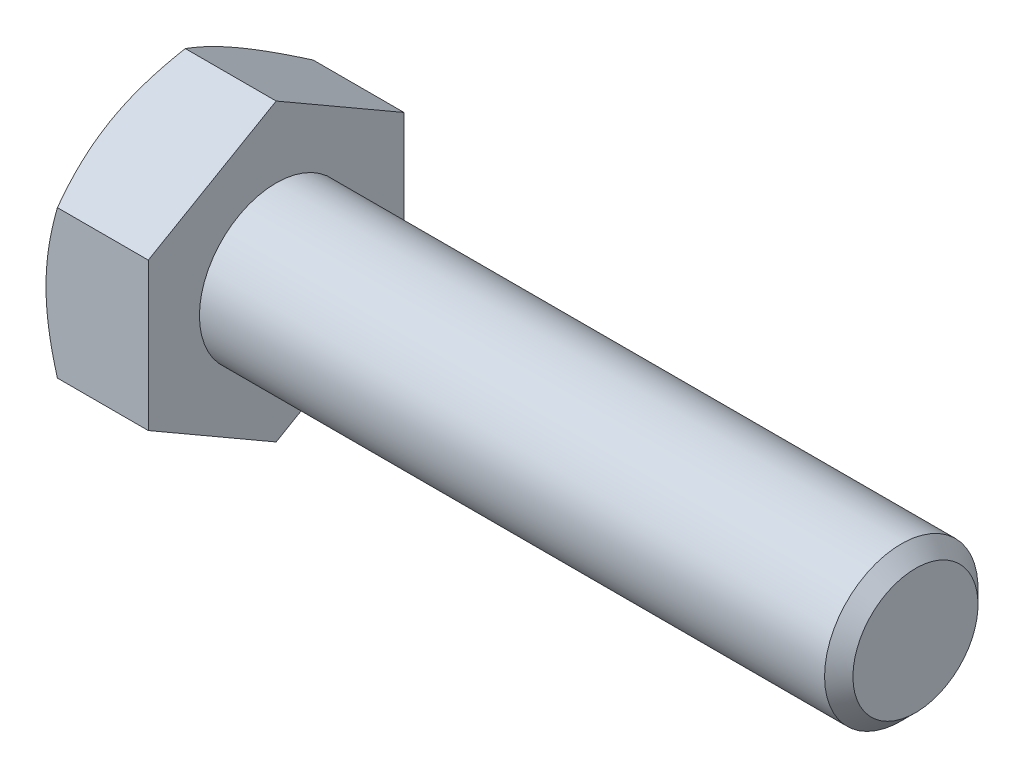
ISO-10303-21;
HEADER;
FILE_DESCRIPTION(('STEP AP214'),'2;1');
FILE_NAME('part.step','',(''),(''),'','','');
FILE_SCHEMA(('AUTOMOTIVE_DESIGN { 1 0 10303 214 1 1 1 1 }'));
ENDSEC;
DATA;
#1=APPLICATION_CONTEXT('core data for automotive mechanical design processes');
#2=APPLICATION_PROTOCOL_DEFINITION('international standard','automotive_design',2000,#1);
#3=PRODUCT_CONTEXT('',#1,'mechanical');
#4=PRODUCT('Part','Part','',(#3));
#5=PRODUCT_RELATED_PRODUCT_CATEGORY('part','',(#4));
#6=PRODUCT_DEFINITION_FORMATION('','',#4);
#7=PRODUCT_DEFINITION_CONTEXT('part definition',#1,'design');
#8=PRODUCT_DEFINITION('design','',#6,#7);
#9=PRODUCT_DEFINITION_SHAPE('','',#8);
#10=(LENGTH_UNIT() NAMED_UNIT(*) SI_UNIT(.MILLI.,.METRE.));
#11=(NAMED_UNIT(*) PLANE_ANGLE_UNIT() SI_UNIT($,.RADIAN.));
#12=(NAMED_UNIT(*) SI_UNIT($,.STERADIAN.) SOLID_ANGLE_UNIT());
#13=UNCERTAINTY_MEASURE_WITH_UNIT(LENGTH_MEASURE(1.E-05),#10,'distance_accuracy_value','');
#14=(GEOMETRIC_REPRESENTATION_CONTEXT(3) GLOBAL_UNCERTAINTY_ASSIGNED_CONTEXT((#13)) GLOBAL_UNIT_ASSIGNED_CONTEXT((#10,
#11,#12)) REPRESENTATION_CONTEXT('',''));
#15=CARTESIAN_POINT('',(0.,0.,0.));
#16=DIRECTION('',(0.,0.,1.));
#17=DIRECTION('',(1.,0.,0.));
#18=AXIS2_PLACEMENT_3D('',#15,#16,#17);
#19=CARTESIAN_POINT('',(4.,2.88675134594813,-5.));
#20=DIRECTION('',(0.,-0.866025403784438,0.500000000000001));
#21=DIRECTION('',(0.,-0.500000000000001,-0.866025403784438));
#22=AXIS2_PLACEMENT_3D('',#19,#20,#21);
#23=PLANE('',#22);
#24=CARTESIAN_POINT('',(0.446648656051827,5.7736181619501,0.0002));
#25=CARTESIAN_POINT('',(0.373386567637634,5.64675433465071,-0.219534594525185));
#26=CARTESIAN_POINT('',(0.306751321918091,5.5188054379059,-0.44114858445958));
#27=CARTESIAN_POINT('',(0.19043899101081,5.26069210252318,-0.888213995453513));
#28=CARTESIAN_POINT('',(0.140803049915789,5.13052307794721,-1.11367335959077));
#29=CARTESIAN_POINT('',(0.0635510254186983,4.87177839004641,-1.56183230522351));
#30=CARTESIAN_POINT('',(0.0354203782834902,4.74324302208387,-1.78446209310419));
#31=CARTESIAN_POINT('',(0.0101949219536848,4.54998783160116,-2.11918990184664));
#32=CARTESIAN_POINT('',(0.00461345976948386,4.48552534905128,-2.23084219680506));
#33=CARTESIAN_POINT('',(-0.000797783248530059,4.35654081066911,-2.4542499706738));
#34=CARTESIAN_POINT('',(-0.000627741741796693,4.2920187567385,-2.56600544629031));
#35=CARTESIAN_POINT('',(0.00775363179203656,4.11524635305244,-2.87218423085064));
#36=CARTESIAN_POINT('',(0.0218297718972512,4.00305457769146,-3.06650608596721));
#37=CARTESIAN_POINT('',(0.0664652571094295,3.77941563226457,-3.4538601019977));
#38=CARTESIAN_POINT('',(0.0970398601475063,3.66796924828418,-3.64689090137157));
#39=CARTESIAN_POINT('',(0.173468493621161,3.44387972423144,-4.03502534247485));
#40=CARTESIAN_POINT('',(0.219646378878676,3.3312648659868,-4.23007999864173));
#41=CARTESIAN_POINT('',(0.324451794491929,3.1077146415794,-4.61728034535877));
#42=CARTESIAN_POINT('',(0.383054703437368,2.99677641204847,-4.80943099540808));
#43=CARTESIAN_POINT('',(0.446648656051822,2.88663587589429,-5.0002));
#44=B_SPLINE_CURVE_WITH_KNOTS('',3,(#24,#25,#26,#27,#28,#29,#30,#31,#32,#33,#34,#35,#36,#37,#38,
#39,#40,#41,#42,#43),.UNSPECIFIED.,.F.,.F.,(4,2,2,2,2,2,2,2,2,4),(0.,0.79255584136309,
1.58701660053333,2.3618153748728,2.74884076077325,3.13585419177295,3.80962362599679,
4.48401723901189,5.17336882348929,5.86136694793725),.UNSPECIFIED.);
#45=CARTESIAN_POINT('',(0.4465819873852,5.77350269189626,0.));
#46=VERTEX_POINT('',#45);
#47=CARTESIAN_POINT('',(0.,4.33012701892219,-2.50000000000001));
#48=VERTEX_POINT('',#47);
#49=EDGE_CURVE('E53',#46,#48,#44,.T.);
#50=ORIENTED_EDGE('',*,*,#49,.F.);
#51=DIRECTION('',(-1.,0.,0.));
#52=VECTOR('',#51,1.);
#53=CARTESIAN_POINT('',(4.,5.77350269189626,0.));
#54=LINE('',#53,#52);
#55=CARTESIAN_POINT('',(4.,5.77350269189626,0.));
#56=VERTEX_POINT('',#55);
#57=EDGE_CURVE('E149',#56,#46,#54,.T.);
#58=ORIENTED_EDGE('',*,*,#57,.F.);
#59=DIRECTION('',(0.,0.500000000000001,0.866025403784438));
#60=VECTOR('',#59,1.);
#61=CARTESIAN_POINT('',(4.,2.88675134594813,-5.));
#62=LINE('',#61,#60);
#63=CARTESIAN_POINT('',(4.,2.88675134594813,-5.));
#64=VERTEX_POINT('',#63);
#65=EDGE_CURVE('E234',#64,#56,#62,.T.);
#66=ORIENTED_EDGE('',*,*,#65,.F.);
#67=DIRECTION('',(-1.,0.,0.));
#68=VECTOR('',#67,1.);
#69=CARTESIAN_POINT('',(4.,2.88675134594813,-5.));
#70=LINE('',#69,#68);
#71=CARTESIAN_POINT('',(0.446581987385196,2.88675134594813,-5.));
#72=VERTEX_POINT('',#71);
#73=EDGE_CURVE('E137',#64,#72,#70,.T.);
#74=ORIENTED_EDGE('',*,*,#73,.T.);
#75=EDGE_CURVE('E131',#48,#72,#44,.T.);
#76=ORIENTED_EDGE('',*,*,#75,.F.);
#77=EDGE_LOOP('',(#50,#58,#66,#74,#76));
#78=FACE_BOUND('',#77,.T.);
#79=ADVANCED_FACE('F37',(#78),#23,.F.);
#80=CARTESIAN_POINT('',(4.,5.77350269189626,0.));
#81=DIRECTION('',(0.,-0.866025403784438,-0.500000000000001));
#82=DIRECTION('',(0.,0.500000000000001,-0.866025403784438));
#83=AXIS2_PLACEMENT_3D('',#80,#81,#82);
#84=PLANE('',#83);
#85=CARTESIAN_POINT('',(0.446648656051825,2.88663587589429,5.0002));
#86=CARTESIAN_POINT('',(0.373386567637632,3.01349970319368,4.78046540547482));
#87=CARTESIAN_POINT('',(0.30675132191809,3.14144859993849,4.55885141554042));
#88=CARTESIAN_POINT('',(0.19043899101081,3.39956193532121,4.11178600454649));
#89=CARTESIAN_POINT('',(0.140803049915788,3.52973095989718,3.88632664040923));
#90=CARTESIAN_POINT('',(0.0635510254186984,3.78847564779797,3.43816769477649));
#91=CARTESIAN_POINT('',(0.0354203782834904,3.91701101576052,3.21553790689581));
#92=CARTESIAN_POINT('',(0.0101949219536852,4.11026620624322,2.88081009815336));
#93=CARTESIAN_POINT('',(0.00461345976948446,4.17472868879311,2.76915780319494));
#94=CARTESIAN_POINT('',(-0.000797783248529398,4.30371322717528,2.54575002932621));
#95=CARTESIAN_POINT('',(-0.000627741741796103,4.36823528110589,2.43399455370969));
#96=CARTESIAN_POINT('',(0.00775363179203727,4.54500768479194,2.12781576914937));
#97=CARTESIAN_POINT('',(0.0218297718972523,4.65719946015293,1.93349391403279));
#98=CARTESIAN_POINT('',(0.0664652571094314,4.88083840557981,1.5461398980023));
#99=CARTESIAN_POINT('',(0.0970398601475084,4.9922847895602,1.35310909862843));
#100=CARTESIAN_POINT('',(0.173468493621164,5.21637431361295,0.964974657525148));
#101=CARTESIAN_POINT('',(0.21964637887868,5.32898917185759,0.769920001358266));
#102=CARTESIAN_POINT('',(0.324451794491933,5.55253939626499,0.382719654641233));
#103=CARTESIAN_POINT('',(0.383054703437373,5.66347762579592,0.190569004591914));
#104=CARTESIAN_POINT('',(0.446648656051827,5.7736181619501,-0.000199999999999844));
#105=B_SPLINE_CURVE_WITH_KNOTS('',3,(#85,#86,#87,#88,#89,#90,#91,#92,#93,#94,#95,#96,#97,#98,
#99,#100,#101,#102,#103,#104),.UNSPECIFIED.,.F.,.F.,(4,2,2,2,2,2,2,2,2,4),(0.,0.792555841363089,
1.58701660053333,2.3618153748728,2.74884076077325,3.13585419177295,3.80962362599679,
4.48401723901189,5.17336882348929,5.86136694793726),.UNSPECIFIED.);
#106=CARTESIAN_POINT('',(0.446581987385198,2.88675134594813,5.));
#107=VERTEX_POINT('',#106);
#108=CARTESIAN_POINT('',(0.,4.33012701892219,2.5));
#109=VERTEX_POINT('',#108);
#110=EDGE_CURVE('E60',#107,#109,#105,.T.);
#111=ORIENTED_EDGE('',*,*,#110,.F.);
#112=DIRECTION('',(-1.,0.,0.));
#113=VECTOR('',#112,1.);
#114=CARTESIAN_POINT('',(4.,2.88675134594813,5.));
#115=LINE('',#114,#113);
#116=CARTESIAN_POINT('',(4.,2.88675134594813,5.));
#117=VERTEX_POINT('',#116);
#118=EDGE_CURVE('E147',#117,#107,#115,.T.);
#119=ORIENTED_EDGE('',*,*,#118,.F.);
#120=DIRECTION('',(0.,-0.500000000000001,0.866025403784438));
#121=VECTOR('',#120,1.);
#122=CARTESIAN_POINT('',(4.,5.77350269189626,0.));
#123=LINE('',#122,#121);
#124=EDGE_CURVE('E232',#56,#117,#123,.T.);
#125=ORIENTED_EDGE('',*,*,#124,.F.);
#126=ORIENTED_EDGE('',*,*,#57,.T.);
#127=EDGE_CURVE('E164',#109,#46,#105,.T.);
#128=ORIENTED_EDGE('',*,*,#127,.F.);
#129=EDGE_LOOP('',(#111,#119,#125,#126,#128));
#130=FACE_BOUND('',#129,.T.);
#131=ADVANCED_FACE('F170',(#130),#84,.F.);
#132=CARTESIAN_POINT('',(4.,2.88675134594813,5.));
#133=DIRECTION('',(0.,0.,-1.));
#134=DIRECTION('',(-1.,0.,0.));
#135=AXIS2_PLACEMENT_3D('',#132,#133,#134);
#136=PLANE('',#135);
#137=CARTESIAN_POINT('',(2.47533544689294,-7.82661640313891,5.));
#138=CARTESIAN_POINT('',(2.36879683507772,-7.60758613024923,5.));
#139=CARTESIAN_POINT('',(2.26325911833055,-7.38806071364412,5.));
#140=CARTESIAN_POINT('',(2.0547470786595,-6.94775649535435,5.));
#141=CARTESIAN_POINT('',(1.95177314617001,-6.72697750897689,5.));
#142=CARTESIAN_POINT('',(1.74844778545274,-6.28280027125598,5.));
#143=CARTESIAN_POINT('',(1.64811306490868,-6.05939434592714,5.));
#144=CARTESIAN_POINT('',(1.45145486004311,-5.61083043832921,5.));
#145=CARTESIAN_POINT('',(1.35513119080617,-5.38567253739806,5.));
#146=CARTESIAN_POINT('',(1.1644503760596,-4.92576614780204,5.));
#147=CARTESIAN_POINT('',(1.07026351405995,-4.69094667859486,5.));
#148=CARTESIAN_POINT('',(0.888844387350834,-4.21858752735363,5.));
#149=CARTESIAN_POINT('',(0.801612892640656,-3.98104754746318,5.));
#150=CARTESIAN_POINT('',(0.636341071883237,-3.50329086404364,5.));
#151=CARTESIAN_POINT('',(0.558282765149709,-3.26308044250487,5.));
#152=CARTESIAN_POINT('',(0.413813856737664,-2.77921467819532,5.));
#153=CARTESIAN_POINT('',(0.347399663631974,-2.53556042276,5.));
#154=CARTESIAN_POINT('',(0.229707450535051,-2.04600448312504,5.));
#155=CARTESIAN_POINT('',(0.178346573442479,-1.80012308686184,5.));
#156=CARTESIAN_POINT('',(0.0936230804935165,-1.30522837494366,5.));
#157=CARTESIAN_POINT('',(0.0602585789244938,-1.05621539022478,5.));
#158=CARTESIAN_POINT('',(0.0146229933804859,-0.559584253783074,5.));
#159=CARTESIAN_POINT('',(0.00207498506584256,-0.311992192967682,5.));
#160=CARTESIAN_POINT('',(-0.00159747165030419,0.18337558405673,5.));
#161=CARTESIAN_POINT('',(0.00727849448086291,0.431151303726633,5.));
#162=CARTESIAN_POINT('',(0.0397265053205842,0.849622860758221,5.));
#163=CARTESIAN_POINT('',(0.0579847912618796,1.02075746544156,5.));
#164=CARTESIAN_POINT('',(0.103624049996722,1.36181398757519,5.));
#165=CARTESIAN_POINT('',(0.131006199082924,1.53173574577271,5.));
#166=CARTESIAN_POINT('',(0.225403333816322,2.03942834541587,5.));
#167=CARTESIAN_POINT('',(0.304653621104037,2.37495177168564,5.));
#168=CARTESIAN_POINT('',(0.442611792168641,2.87686006020153,5.));
#169=CARTESIAN_POINT('',(0.492453035928118,3.04583048582566,5.));
#170=CARTESIAN_POINT('',(0.597441969480142,3.3821306103866,5.));
#171=CARTESIAN_POINT('',(0.652589698776807,3.54946029709871,5.));
#172=CARTESIAN_POINT('',(0.767295730006399,3.88253122341819,5.));
#173=CARTESIAN_POINT('',(0.826852713137817,4.04827292137367,5.));
#174=CARTESIAN_POINT('',(0.949663499110054,4.37837269604186,5.));
#175=CARTESIAN_POINT('',(1.01291722636637,4.54273080096529,5.));
#176=CARTESIAN_POINT('',(1.18384085306905,4.97467594039772,5.));
#177=CARTESIAN_POINT('',(1.29410564783453,5.24123504256651,5.));
#178=CARTESIAN_POINT('',(1.52085041203993,5.77170603526337,5.));
#179=CARTESIAN_POINT('',(1.63733099805397,6.03561766007931,5.));
#180=CARTESIAN_POINT('',(1.87507624393348,6.5613807877834,5.));
#181=CARTESIAN_POINT('',(1.99634255328238,6.82323154239332,5.));
#182=CARTESIAN_POINT('',(2.24254703861692,7.34518395602018,5.));
#183=CARTESIAN_POINT('',(2.36748508200601,7.60528567778377,5.));
#184=CARTESIAN_POINT('',(2.62044102887897,8.12446478659925,5.));
#185=CARTESIAN_POINT('',(2.74846325062125,8.38354006552436,5.));
#186=CARTESIAN_POINT('',(3.00682668967548,8.90053291127543,5.));
#187=CARTESIAN_POINT('',(3.13716793074431,9.15845046620732,5.));
#188=CARTESIAN_POINT('',(3.53092424591315,9.93067662274983,5.));
#189=CARTESIAN_POINT('',(3.79712405172273,10.4435647238032,5.));
#190=CARTESIAN_POINT('',(4.30724046881169,11.4147548711532,5.));
#191=CARTESIAN_POINT('',(4.55067498762243,11.873311348306,5.));
#192=CARTESIAN_POINT('',(5.04052915785296,12.7888590468284,5.));
#193=CARTESIAN_POINT('',(5.28694897482742,13.2458501795697,5.));
#194=CARTESIAN_POINT('',(5.78122505346438,14.1571829390174,5.));
#195=CARTESIAN_POINT('',(6.02907430461242,14.6115283739737,5.));
#196=CARTESIAN_POINT('',(6.52648185519848,15.5192398746589,5.));
#197=CARTESIAN_POINT('',(6.77604002809904,15.9726060096993,5.));
#198=CARTESIAN_POINT('',(7.02622264559115,16.4256251044156,5.));
#199=B_SPLINE_CURVE_WITH_KNOTS('',3,(#137,#138,#139,#140,#141,#142,#143,#144,#145,#146,#147,
#148,#149,#150,#151,#152,#153,#154,#155,#156,#157,#158,#159,#160,#161,#162,#163,#164,#165,#166,
#167,#168,#169,#170,#171,#172,#173,#174,#175,#176,#177,#178,#179,#180,#181,#182,#183,#184,#185,
#186,#187,#188,#189,#190,#191,#192,#193,#194,#195,#196,#197,#198),.UNSPECIFIED.,.F.,.F.,(4,2,2,
2,2,2,2,2,2,2,2,2,2,2,2,2,2,2,2,2,2,2,2,2,2,2,2,2,2,2,4),(0.,0.730708682143099,1.46152797033751,
2.19620403652928,2.930846195478,3.68977491658213,4.44878753915767,5.20628666210828,
5.9635517348485,6.71656679485872,7.46950293642268,8.212339912373,8.95519126159774,
9.4712599123247,9.98739512288343,11.0201893937443,11.5486465414698,12.0771076235976,
12.6054112774226,13.1337041332035,13.9989833719717,14.864348602062,15.7300147459346,
16.5956496665092,17.4625765068272,18.3295122333794,20.0630293163822,21.6205191219182,
23.1780956996636,24.7307447704824,26.2832800921359),.UNSPECIFIED.);
#200=CARTESIAN_POINT('',(0.446581987385201,-2.88675134594813,5.));
#201=VERTEX_POINT('',#200);
#202=CARTESIAN_POINT('',(0.,0.,5.));
#203=VERTEX_POINT('',#202);
#204=EDGE_CURVE('E244',#201,#203,#199,.T.);
#205=ORIENTED_EDGE('',*,*,#204,.F.);
#206=DIRECTION('',(-1.,0.,0.));
#207=VECTOR('',#206,1.);
#208=CARTESIAN_POINT('',(4.,-2.88675134594814,5.));
#209=LINE('',#208,#207);
#210=CARTESIAN_POINT('',(4.,-2.88675134594814,5.));
#211=VERTEX_POINT('',#210);
#212=EDGE_CURVE('E139',#211,#201,#209,.T.);
#213=ORIENTED_EDGE('',*,*,#212,.F.);
#214=DIRECTION('',(0.,-1.,0.));
#215=VECTOR('',#214,1.);
#216=CARTESIAN_POINT('',(4.,2.88675134594813,5.));
#217=LINE('',#216,#215);
#218=EDGE_CURVE('E228',#117,#211,#217,.T.);
#219=ORIENTED_EDGE('',*,*,#218,.F.);
#220=ORIENTED_EDGE('',*,*,#118,.T.);
#221=EDGE_CURVE('E186',#203,#107,#199,.T.);
#222=ORIENTED_EDGE('',*,*,#221,.F.);
#223=EDGE_LOOP('',(#205,#213,#219,#220,#222));
#224=FACE_BOUND('',#223,.T.);
#225=ADVANCED_FACE('F250',(#224),#136,.F.);
#226=CARTESIAN_POINT('',(4.,-5.77350269189627,0.));
#227=DIRECTION('',(0.,0.866025403784438,-0.500000000000001));
#228=DIRECTION('',(0.,0.500000000000001,0.866025403784438));
#229=AXIS2_PLACEMENT_3D('',#226,#227,#228);
#230=PLANE('',#229);
#231=CARTESIAN_POINT('',(0.446648656051834,-5.77361816195011,-0.000199999999999416));
#232=CARTESIAN_POINT('',(0.37338656763764,-5.64675433465072,0.219534594525186));
#233=CARTESIAN_POINT('',(0.306751321918098,-5.51880543790591,0.441148584459581));
#234=CARTESIAN_POINT('',(0.190438991010817,-5.26069210252319,0.888213995453515));
#235=CARTESIAN_POINT('',(0.140803049915795,-5.13052307794722,1.11367335959078));
#236=CARTESIAN_POINT('',(0.0635510254187044,-4.87177839004642,1.56183230522351));
#237=CARTESIAN_POINT('',(0.0354203782834961,-4.74324302208388,1.7844620931042));
#238=CARTESIAN_POINT('',(0.0101949219536906,-4.54998783160117,2.11918990184665));
#239=CARTESIAN_POINT('',(0.00461345976948978,-4.48552534905129,2.23084219680506));
#240=CARTESIAN_POINT('',(-0.000797783248523955,-4.35654081066912,2.4542499706738));
#241=CARTESIAN_POINT('',(-0.000627741741790438,-4.29201875673851,2.56600544629032));
#242=CARTESIAN_POINT('',(0.00775363179204282,-4.11524635305245,2.87218423085064));
#243=CARTESIAN_POINT('',(0.0218297718972569,-4.00305457769147,3.06650608596722));
#244=CARTESIAN_POINT('',(0.0664652571094348,-3.77941563226458,3.45386010199771));
#245=CARTESIAN_POINT('',(0.0970398601475117,-3.66796924828419,3.64689090137157));
#246=CARTESIAN_POINT('',(0.173468493621166,-3.44387972423145,4.03502534247486));
#247=CARTESIAN_POINT('',(0.219646378878682,-3.33126486598681,4.23007999864174));
#248=CARTESIAN_POINT('',(0.324451794491935,-3.10771464157941,4.61728034535877));
#249=CARTESIAN_POINT('',(0.383054703437374,-2.99677641204848,4.80943099540809));
#250=CARTESIAN_POINT('',(0.446648656051827,-2.8866358758943,5.0002));
#251=B_SPLINE_CURVE_WITH_KNOTS('',3,(#231,#232,#233,#234,#235,#236,#237,#238,#239,#240,#241,
#242,#243,#244,#245,#246,#247,#248,#249,#250),.UNSPECIFIED.,.F.,.F.,(4,2,2,2,2,2,2,2,2,4),(0.,
0.792555841363092,1.58701660053334,2.36181537487281,2.74884076077326,3.13585419177296,
3.8096236259968,4.4840172390119,5.17336882348929,5.86136694793726),.UNSPECIFIED.);
#252=CARTESIAN_POINT('',(0.446581987385208,-5.77350269189627,0.));
#253=VERTEX_POINT('',#252);
#254=CARTESIAN_POINT('',(0.,-4.33012701892219,2.50000000000001));
#255=VERTEX_POINT('',#254);
#256=EDGE_CURVE('E172',#253,#255,#251,.T.);
#257=ORIENTED_EDGE('',*,*,#256,.F.);
#258=DIRECTION('',(-1.,0.,0.));
#259=VECTOR('',#258,1.);
#260=CARTESIAN_POINT('',(4.,-5.77350269189627,0.));
#261=LINE('',#260,#259);
#262=CARTESIAN_POINT('',(4.,-5.77350269189627,0.));
#263=VERTEX_POINT('',#262);
#264=EDGE_CURVE('E136',#263,#253,#261,.T.);
#265=ORIENTED_EDGE('',*,*,#264,.F.);
#266=DIRECTION('',(0.,-0.500000000000001,-0.866025403784438));
#267=VECTOR('',#266,1.);
#268=CARTESIAN_POINT('',(4.,-5.77350269189627,0.));
#269=LINE('',#268,#267);
#270=EDGE_CURVE('E226',#211,#263,#269,.T.);
#271=ORIENTED_EDGE('',*,*,#270,.F.);
#272=ORIENTED_EDGE('',*,*,#212,.T.);
#273=EDGE_CURVE('E174',#255,#201,#251,.T.);
#274=ORIENTED_EDGE('',*,*,#273,.F.);
#275=EDGE_LOOP('',(#257,#265,#271,#272,#274));
#276=FACE_BOUND('',#275,.T.);
#277=ADVANCED_FACE('F222',(#276),#230,.F.);
#278=CARTESIAN_POINT('',(4.,-2.88675134594813,-5.));
#279=DIRECTION('',(0.,0.866025403784438,0.500000000000001));
#280=DIRECTION('',(0.,-0.500000000000001,0.866025403784438));
#281=AXIS2_PLACEMENT_3D('',#278,#279,#280);
#282=PLANE('',#281);
#283=CARTESIAN_POINT('',(0.446648656051825,-2.8866358758943,-5.0002));
#284=CARTESIAN_POINT('',(0.373386567637632,-3.01349970319369,-4.78046540547481));
#285=CARTESIAN_POINT('',(0.30675132191809,-3.1414485999385,-4.55885141554042));
#286=CARTESIAN_POINT('',(0.190438991010811,-3.39956193532121,-4.11178600454649));
#287=CARTESIAN_POINT('',(0.140803049915791,-3.52973095989718,-3.88632664040923));
#288=CARTESIAN_POINT('',(0.063551025418701,-3.78847564779798,-3.43816769477649));
#289=CARTESIAN_POINT('',(0.0354203782834928,-3.91701101576053,-3.21553790689581));
#290=CARTESIAN_POINT('',(0.0101949219536886,-4.11026620624323,-2.88081009815336));
#291=CARTESIAN_POINT('',(0.00461345976948832,-4.17472868879312,-2.76915780319494));
#292=CARTESIAN_POINT('',(-0.000797783248524761,-4.30371322717529,-2.5457500293262));
#293=CARTESIAN_POINT('',(-0.00062774174179117,-4.3682352811059,-2.43399455370969));
#294=CARTESIAN_POINT('',(0.00775363179204274,-4.54500768479195,-2.12781576914936));
#295=CARTESIAN_POINT('',(0.0218297718972578,-4.65719946015294,-1.93349391403279));
#296=CARTESIAN_POINT('',(0.0664652571094372,-4.88083840557983,-1.5461398980023));
#297=CARTESIAN_POINT('',(0.0970398601475143,-4.99228478956022,-1.35310909862843));
#298=CARTESIAN_POINT('',(0.17346849362117,-5.21637431361296,-0.964974657525146));
#299=CARTESIAN_POINT('',(0.219646378878686,-5.3289891718576,-0.769920001358264));
#300=CARTESIAN_POINT('',(0.32445179449194,-5.552539396265,-0.382719654641232));
#301=CARTESIAN_POINT('',(0.38305470343738,-5.66347762579593,-0.190569004591914));
#302=CARTESIAN_POINT('',(0.446648656051834,-5.77361816195011,0.000200000000000331));
#303=B_SPLINE_CURVE_WITH_KNOTS('',3,(#283,#284,#285,#286,#287,#288,#289,#290,#291,#292,#293,
#294,#295,#296,#297,#298,#299,#300,#301,#302),.UNSPECIFIED.,.F.,.F.,(4,2,2,2,2,2,2,2,2,4),(0.,
0.792555841363089,1.58701660053333,2.3618153748728,2.74884076077325,3.13585419177295,
3.80962362599679,4.48401723901189,5.17336882348929,5.86136694793726),.UNSPECIFIED.);
#304=CARTESIAN_POINT('',(0.446581987384944,-2.88675134594852,-5.));
#305=VERTEX_POINT('',#304);
#306=CARTESIAN_POINT('',(0.,-4.33012701892219,-2.50000000000001));
#307=VERTEX_POINT('',#306);
#308=EDGE_CURVE('E113',#305,#307,#303,.T.);
#309=ORIENTED_EDGE('',*,*,#308,.F.);
#310=DIRECTION('',(-1.,0.,0.));
#311=VECTOR('',#310,1.);
#312=CARTESIAN_POINT('',(4.,-2.88675134594813,-5.));
#313=LINE('',#312,#311);
#314=CARTESIAN_POINT('',(4.,-2.88675134594813,-5.));
#315=VERTEX_POINT('',#314);
#316=EDGE_CURVE('E127',#315,#305,#313,.T.);
#317=ORIENTED_EDGE('',*,*,#316,.F.);
#318=DIRECTION('',(0.,0.500000000000001,-0.866025403784438));
#319=VECTOR('',#318,1.);
#320=CARTESIAN_POINT('',(4.,-2.88675134594813,-5.));
#321=LINE('',#320,#319);
#322=EDGE_CURVE('E224',#263,#315,#321,.T.);
#323=ORIENTED_EDGE('',*,*,#322,.F.);
#324=ORIENTED_EDGE('',*,*,#264,.T.);
#325=EDGE_CURVE('E130',#307,#253,#303,.T.);
#326=ORIENTED_EDGE('',*,*,#325,.F.);
#327=EDGE_LOOP('',(#309,#317,#323,#324,#326));
#328=FACE_BOUND('',#327,.T.);
#329=ADVANCED_FACE('F125',(#328),#282,.F.);
#330=CARTESIAN_POINT('',(4.,2.88675134594813,-5.));
#331=DIRECTION('',(0.,0.,1.));
#332=DIRECTION('',(0.,-1.,0.));
#333=AXIS2_PLACEMENT_3D('',#330,#331,#332);
#334=PLANE('',#333);
#335=CARTESIAN_POINT('',(2.47533544773016,-7.82661640485967,-5.));
#336=CARTESIAN_POINT('',(2.36879683587998,-7.60758613191208,-5.));
#337=CARTESIAN_POINT('',(2.26325911909788,-7.38806071524903,-5.));
#338=CARTESIAN_POINT('',(2.05474707935714,-6.9477564968432,-5.));
#339=CARTESIAN_POINT('',(1.95177314683289,-6.72697751040762,-5.));
#340=CARTESIAN_POINT('',(1.74844778604607,-6.28280027256958,-5.));
#341=CARTESIAN_POINT('',(1.64811306546723,-6.05939434718172,-5.));
#342=CARTESIAN_POINT('',(1.45145486053268,-5.61083043946536,-5.));
#343=CARTESIAN_POINT('',(1.35513119126153,-5.38567253847478,-5.));
#344=CARTESIAN_POINT('',(1.16445037644561,-4.92576614875537,-5.));
#345=CARTESIAN_POINT('',(1.07026351441087,-4.69094667948418,-5.));
#346=CARTESIAN_POINT('',(0.888844387633464,-4.2185875281139,-5.));
#347=CARTESIAN_POINT('',(0.801612892890077,-3.98104754815841,-5.));
#348=CARTESIAN_POINT('',(0.636341072069417,-3.50329086460758,-5.));
#349=CARTESIAN_POINT('',(0.558282765305848,-3.26308044300256,-5.));
#350=CARTESIAN_POINT('',(0.413813856838624,-2.77921467855872,-5.));
#351=CARTESIAN_POINT('',(0.347399663707794,-2.53556042305535,-5.));
#352=CARTESIAN_POINT('',(0.229707450560145,-2.04600448324933,-5.));
#353=CARTESIAN_POINT('',(0.178346573443935,-1.80012308688265,-5.));
#354=CARTESIAN_POINT('',(0.0936230804633163,-1.305228374755,-5.));
#355=CARTESIAN_POINT('',(0.0602585788862639,-1.05621538993015,-5.));
#356=CARTESIAN_POINT('',(0.0146229933450837,-0.559584253278235,-5.));
#357=CARTESIAN_POINT('',(0.00207498504094966,-0.311992192358639,-5.));
#358=CARTESIAN_POINT('',(-0.00159747163599619,0.183375584872585,-5.));
#359=CARTESIAN_POINT('',(0.00727849452386728,0.431151304645094,-5.));
#360=CARTESIAN_POINT('',(0.0397265054214749,0.849622861805587,-5.));
#361=CARTESIAN_POINT('',(0.0579847913857267,1.02075746651638,-5.));
#362=CARTESIAN_POINT('',(0.103624050167703,1.36181398870371,-5.));
#363=CARTESIAN_POINT('',(0.131006199278083,1.53173574692745,-5.));
#364=CARTESIAN_POINT('',(0.225403334084523,2.03942834664788,-5.));
#365=CARTESIAN_POINT('',(0.30465362142158,2.37495177296714,-5.));
#366=CARTESIAN_POINT('',(0.442611792558999,2.87686006155706,-5.));
#367=CARTESIAN_POINT('',(0.492453036342916,3.0458304872064,-5.));
#368=CARTESIAN_POINT('',(0.597441969943077,3.38213061181746,-5.));
#369=CARTESIAN_POINT('',(0.652589699263438,3.54946029855449,-5.));
#370=CARTESIAN_POINT('',(0.767295730539579,3.88253122492363,-5.));
#371=CARTESIAN_POINT('',(0.826852713693847,4.04827292290385,-5.));
#372=CARTESIAN_POINT('',(0.949663499710996,4.37837269762152,-5.));
#373=CARTESIAN_POINT('',(1.01291722698938,4.5427308025697,-5.));
#374=CARTESIAN_POINT('',(1.18384085372923,4.97467594201679,-5.));
#375=CARTESIAN_POINT('',(1.29410564850765,5.24123504417617,-5.));
#376=CARTESIAN_POINT('',(1.5208504127353,5.7717060368554,-5.));
#377=CARTESIAN_POINT('',(1.63733099875865,6.03561766166312,-5.));
#378=CARTESIAN_POINT('',(1.87507624465412,6.56138078935165,-5.));
#379=CARTESIAN_POINT('',(1.99634255400966,6.82323154395421,-5.));
#380=CARTESIAN_POINT('',(2.24254703935561,7.34518395756717,-5.));
#381=CARTESIAN_POINT('',(2.36748508274945,7.6052856793242,-5.));
#382=CARTESIAN_POINT('',(2.62044102963033,8.12446478812678,-5.));
#383=CARTESIAN_POINT('',(2.74846325137577,8.38354006704556,-5.));
#384=CARTESIAN_POINT('',(3.00682669043526,8.90053291278444,-5.));
#385=CARTESIAN_POINT('',(3.13716793150619,9.15845046771046,-5.));
#386=CARTESIAN_POINT('',(3.5309242466802,9.93067662423608,-5.));
#387=CARTESIAN_POINT('',(3.79712405249166,10.443564725279,-4.99999999999999));
#388=CARTESIAN_POINT('',(4.30724046958685,11.4147548726185,-4.99999999999999));
#389=CARTESIAN_POINT('',(4.55067498840221,11.8733113497711,-4.99999999999999));
#390=CARTESIAN_POINT('',(5.04052915864101,12.7888590482936,-4.99999999999999));
#391=CARTESIAN_POINT('',(5.28694897561914,13.2458501810352,-4.99999999999999));
#392=CARTESIAN_POINT('',(5.78122505426355,14.1571829404852,-4.99999999999999));
#393=CARTESIAN_POINT('',(6.02907430541541,14.6115283754435,-4.99999999999999));
#394=CARTESIAN_POINT('',(6.52648185600864,15.519239876133,-4.99999999999999));
#395=CARTESIAN_POINT('',(6.77604002891257,15.9726060111757,-4.99999999999999));
#396=CARTESIAN_POINT('',(7.02622264640791,16.4256251058944,-4.99999999999999));
#397=B_SPLINE_CURVE_WITH_KNOTS('',3,(#335,#336,#337,#338,#339,#340,#341,#342,#343,#344,#345,
#346,#347,#348,#349,#350,#351,#352,#353,#354,#355,#356,#357,#358,#359,#360,#361,#362,#363,#364,
#365,#366,#367,#368,#369,#370,#371,#372,#373,#374,#375,#376,#377,#378,#379,#380,#381,#382,#383,
#384,#385,#386,#387,#388,#389,#390,#391,#392,#393,#394,#395,#396),.UNSPECIFIED.,.F.,.F.,(4,2,2,
2,2,2,2,2,2,2,2,2,2,2,2,2,2,2,2,2,2,2,2,2,2,2,2,2,2,2,4),(0.,0.730708682345171,1.46152797074168,
2.19620403713772,2.93084619629067,3.6897749176122,4.4487875404052,5.20628666357255,
5.96355173652935,6.71656679685729,7.4695029387385,8.21233991499823,8.95519126453254,
9.4712599153487,9.98739512599664,11.0201893970363,11.5486465448551,12.0771076270762,
12.6054112809942,13.1337041368682,13.9989833756252,14.8643486057043,15.7300147495654,
16.5956496701284,17.4625765104336,18.329512236973,20.0630293199505,21.6205191254926,
23.178095703244,24.7307447740735,26.2832800957379),.UNSPECIFIED.);
#398=CARTESIAN_POINT('',(0.,0.,-5.));
#399=VERTEX_POINT('',#398);
#400=EDGE_CURVE('E119',#72,#399,#397,.F.);
#401=ORIENTED_EDGE('',*,*,#400,.F.);
#402=ORIENTED_EDGE('',*,*,#73,.F.);
#403=DIRECTION('',(0.,1.,0.));
#404=VECTOR('',#403,1.);
#405=CARTESIAN_POINT('',(4.,2.88675134594813,-5.));
#406=LINE('',#405,#404);
#407=EDGE_CURVE('E135',#315,#64,#406,.T.);
#408=ORIENTED_EDGE('',*,*,#407,.F.);
#409=ORIENTED_EDGE('',*,*,#316,.T.);
#410=EDGE_CURVE('E110',#399,#305,#397,.F.);
#411=ORIENTED_EDGE('',*,*,#410,.F.);
#412=EDGE_LOOP('',(#401,#402,#408,#409,#411));
#413=FACE_BOUND('',#412,.T.);
#414=ADVANCED_FACE('F133',(#413),#334,.F.);
#415=CARTESIAN_POINT('',(4.,0.,-9.99999999999998));
#416=DIRECTION('',(1.,0.,0.));
#417=DIRECTION('',(0.,0.,-1.));
#418=AXIS2_PLACEMENT_3D('',#415,#416,#417);
#419=PLANE('',#418);
#420=ORIENTED_EDGE('',*,*,#65,.T.);
#421=ORIENTED_EDGE('',*,*,#124,.T.);
#422=ORIENTED_EDGE('',*,*,#218,.T.);
#423=ORIENTED_EDGE('',*,*,#270,.T.);
#424=ORIENTED_EDGE('',*,*,#322,.T.);
#425=ORIENTED_EDGE('',*,*,#407,.T.);
#426=EDGE_LOOP('',(#420,#421,#422,#423,#424,#425));
#427=FACE_BOUND('',#426,.T.);
#428=CARTESIAN_POINT('',(4.,0.,0.));
#429=DIRECTION('',(1.,0.,0.));
#430=DIRECTION('',(0.,0.,-1.));
#431=AXIS2_PLACEMENT_3D('',#428,#429,#430);
#432=CIRCLE('',#431,3.);
#433=CARTESIAN_POINT('',(4.,0.,-3.));
#434=VERTEX_POINT('',#433);
#435=EDGE_CURVE('E237',#434,#434,#432,.F.);
#436=ORIENTED_EDGE('',*,*,#435,.T.);
#437=EDGE_LOOP('',(#436));
#438=FACE_BOUND('',#437,.T.);
#439=ADVANCED_FACE('F252',(#427,#438),#419,.T.);
#440=CARTESIAN_POINT('',(0.,0.,0.));
#441=DIRECTION('',(-1.,0.,0.));
#442=DIRECTION('',(0.,0.,1.));
#443=AXIS2_PLACEMENT_3D('',#440,#441,#442);
#444=CYLINDRICAL_SURFACE('',#443,3.);
#445=ORIENTED_EDGE('',*,*,#435,.F.);
#446=EDGE_LOOP('',(#445));
#447=FACE_BOUND('',#446,.T.);
#448=CARTESIAN_POINT('',(28.4455,0.,0.));
#449=DIRECTION('',(-1.,0.,0.));
#450=DIRECTION('',(0.,0.,1.));
#451=AXIS2_PLACEMENT_3D('',#448,#449,#450);
#452=CIRCLE('',#451,3.);
#453=CARTESIAN_POINT('',(28.4455,0.,3.));
#454=VERTEX_POINT('',#453);
#455=EDGE_CURVE('E240',#454,#454,#452,.T.);
#456=ORIENTED_EDGE('',*,*,#455,.T.);
#457=EDGE_LOOP('',(#456));
#458=FACE_BOUND('',#457,.T.);
#459=ADVANCED_FACE('F284',(#447,#458),#444,.T.);
#460=CARTESIAN_POINT('',(29.,0.,0.));
#461=DIRECTION('',(-1.,0.,0.));
#462=DIRECTION('',(0.,0.,1.));
#463=AXIS2_PLACEMENT_3D('',#460,#461,#462);
#464=CONICAL_SURFACE('',#463,2.4455,0.785398163397449);
#465=ORIENTED_EDGE('',*,*,#455,.F.);
#466=EDGE_LOOP('',(#465));
#467=FACE_BOUND('',#466,.T.);
#468=CARTESIAN_POINT('',(29.,0.,0.));
#469=DIRECTION('',(-1.,0.,0.));
#470=DIRECTION('',(0.,0.,1.));
#471=AXIS2_PLACEMENT_3D('',#468,#469,#470);
#472=CIRCLE('',#471,2.4455);
#473=CARTESIAN_POINT('',(29.,0.,2.4455));
#474=VERTEX_POINT('',#473);
#475=EDGE_CURVE('E242',#474,#474,#472,.T.);
#476=ORIENTED_EDGE('',*,*,#475,.T.);
#477=EDGE_LOOP('',(#476));
#478=FACE_BOUND('',#477,.T.);
#479=ADVANCED_FACE('F286',(#467,#478),#464,.T.);
#480=CARTESIAN_POINT('',(29.,0.,0.));
#481=DIRECTION('',(-1.,0.,0.));
#482=DIRECTION('',(0.,0.,1.));
#483=AXIS2_PLACEMENT_3D('',#480,#481,#482);
#484=PLANE('',#483);
#485=ORIENTED_EDGE('',*,*,#475,.F.);
#486=EDGE_LOOP('',(#485));
#487=FACE_BOUND('',#486,.T.);
#488=ADVANCED_FACE('F199',(#487),#484,.F.);
#489=CARTESIAN_POINT('',(0.,0.,0.));
#490=DIRECTION('',(1.,0.,0.));
#491=DIRECTION('',(0.,0.,-1.));
#492=AXIS2_PLACEMENT_3D('',#489,#490,#491);
#493=CONICAL_SURFACE('',#492,5.,1.0471975511966);
#494=ORIENTED_EDGE('',*,*,#308,.T.);
#495=CARTESIAN_POINT('',(0.,0.,0.));
#496=DIRECTION('',(1.,0.,0.));
#497=DIRECTION('',(0.,0.,-1.));
#498=AXIS2_PLACEMENT_3D('',#495,#496,#497);
#499=CIRCLE('',#498,5.);
#500=EDGE_CURVE('E41',#307,#399,#499,.T.);
#501=ORIENTED_EDGE('',*,*,#500,.T.);
#502=ORIENTED_EDGE('',*,*,#410,.T.);
#503=EDGE_LOOP('',(#494,#501,#502));
#504=FACE_BOUND('',#503,.T.);
#505=ADVANCED_FACE('F112',(#504),#493,.T.);
#506=ORIENTED_EDGE('',*,*,#256,.T.);
#507=EDGE_CURVE('E154',#255,#307,#499,.T.);
#508=ORIENTED_EDGE('',*,*,#507,.T.);
#509=ORIENTED_EDGE('',*,*,#325,.T.);
#510=EDGE_LOOP('',(#506,#508,#509));
#511=FACE_BOUND('',#510,.T.);
#512=ADVANCED_FACE('F198',(#511),#493,.T.);
#513=ORIENTED_EDGE('',*,*,#204,.T.);
#514=EDGE_CURVE('E155',#203,#255,#499,.T.);
#515=ORIENTED_EDGE('',*,*,#514,.T.);
#516=ORIENTED_EDGE('',*,*,#273,.T.);
#517=EDGE_LOOP('',(#513,#515,#516));
#518=FACE_BOUND('',#517,.T.);
#519=ADVANCED_FACE('F193',(#518),#493,.T.);
#520=ORIENTED_EDGE('',*,*,#221,.T.);
#521=ORIENTED_EDGE('',*,*,#110,.T.);
#522=CARTESIAN_POINT('',(0.,0.,0.));
#523=DIRECTION('',(-1.,0.,0.));
#524=DIRECTION('',(0.,0.,1.));
#525=AXIS2_PLACEMENT_3D('',#522,#523,#524);
#526=CIRCLE('',#525,5.);
#527=EDGE_CURVE('E120',#203,#109,#526,.T.);
#528=ORIENTED_EDGE('',*,*,#527,.F.);
#529=EDGE_LOOP('',(#520,#521,#528));
#530=FACE_BOUND('',#529,.T.);
#531=ADVANCED_FACE('F197',(#530),#493,.T.);
#532=ORIENTED_EDGE('',*,*,#127,.T.);
#533=ORIENTED_EDGE('',*,*,#49,.T.);
#534=EDGE_CURVE('E46',#48,#109,#499,.T.);
#535=ORIENTED_EDGE('',*,*,#534,.T.);
#536=EDGE_LOOP('',(#532,#533,#535));
#537=FACE_BOUND('',#536,.T.);
#538=ADVANCED_FACE('F163',(#537),#493,.T.);
#539=ORIENTED_EDGE('',*,*,#75,.T.);
#540=ORIENTED_EDGE('',*,*,#400,.T.);
#541=EDGE_CURVE('E11',#399,#48,#499,.T.);
#542=ORIENTED_EDGE('',*,*,#541,.T.);
#543=EDGE_LOOP('',(#539,#540,#542));
#544=FACE_BOUND('',#543,.T.);
#545=ADVANCED_FACE('F256',(#544),#493,.T.);
#546=CARTESIAN_POINT('',(0.,0.,-9.99999999999998));
#547=DIRECTION('',(1.,0.,0.));
#548=DIRECTION('',(0.,0.,-1.));
#549=AXIS2_PLACEMENT_3D('',#546,#547,#548);
#550=PLANE('',#549);
#551=ORIENTED_EDGE('',*,*,#541,.F.);
#552=ORIENTED_EDGE('',*,*,#500,.F.);
#553=ORIENTED_EDGE('',*,*,#507,.F.);
#554=ORIENTED_EDGE('',*,*,#514,.F.);
#555=ORIENTED_EDGE('',*,*,#527,.T.);
#556=ORIENTED_EDGE('',*,*,#534,.F.);
#557=EDGE_LOOP('',(#551,#552,#553,#554,#555,#556));
#558=FACE_BOUND('',#557,.T.);
#559=ADVANCED_FACE('F167',(#558),#550,.F.);
#560=CLOSED_SHELL('',(#79,#131,#225,#277,#329,#414,#439,#459,#479,#488,#505,#512,#519,#531,#538,
#545,#559));
#561=MANIFOLD_SOLID_BREP('B2',#560);
#562=ADVANCED_BREP_SHAPE_REPRESENTATION('',(#18,#561),#14);
#563=SHAPE_DEFINITION_REPRESENTATION(#9,#562);
ENDSEC;
END-ISO-10303-21;
